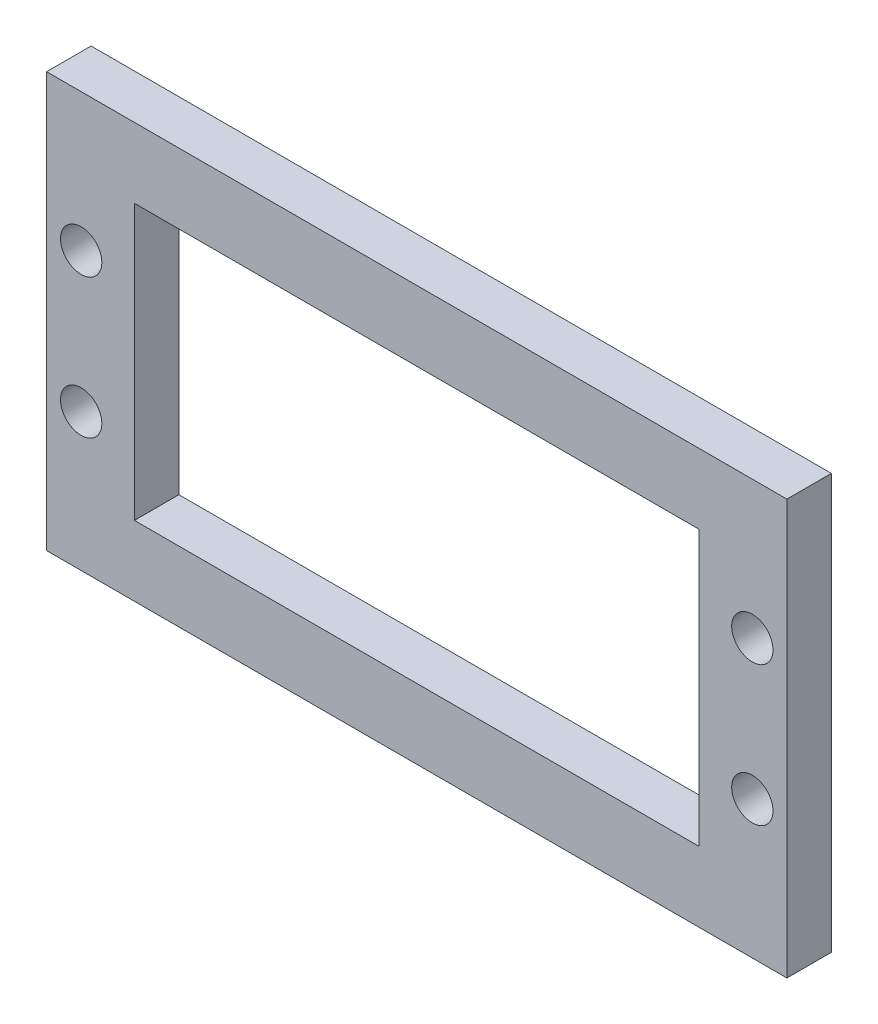
ISO-10303-21;
HEADER;
FILE_DESCRIPTION(('STEP AP214'),'2;1');
FILE_NAME('part.step','',(''),(''),'','','');
FILE_SCHEMA(('AUTOMOTIVE_DESIGN { 1 0 10303 214 1 1 1 1 }'));
ENDSEC;
DATA;
#1=APPLICATION_CONTEXT('core data for automotive mechanical design processes');
#2=APPLICATION_PROTOCOL_DEFINITION('international standard','automotive_design',2000,#1);
#3=PRODUCT_CONTEXT('',#1,'mechanical');
#4=PRODUCT('Part','Part','',(#3));
#5=PRODUCT_RELATED_PRODUCT_CATEGORY('part','',(#4));
#6=PRODUCT_DEFINITION_FORMATION('','',#4);
#7=PRODUCT_DEFINITION_CONTEXT('part definition',#1,'design');
#8=PRODUCT_DEFINITION('design','',#6,#7);
#9=PRODUCT_DEFINITION_SHAPE('','',#8);
#10=(LENGTH_UNIT() NAMED_UNIT(*) SI_UNIT(.MILLI.,.METRE.));
#11=(NAMED_UNIT(*) PLANE_ANGLE_UNIT() SI_UNIT($,.RADIAN.));
#12=(NAMED_UNIT(*) SI_UNIT($,.STERADIAN.) SOLID_ANGLE_UNIT());
#13=UNCERTAINTY_MEASURE_WITH_UNIT(LENGTH_MEASURE(1.E-05),#10,'distance_accuracy_value','');
#14=(GEOMETRIC_REPRESENTATION_CONTEXT(3) GLOBAL_UNCERTAINTY_ASSIGNED_CONTEXT((#13)) GLOBAL_UNIT_ASSIGNED_CONTEXT((#10,
#11,#12)) REPRESENTATION_CONTEXT('',''));
#15=CARTESIAN_POINT('',(0.,0.,0.));
#16=DIRECTION('',(0.,0.,1.));
#17=DIRECTION('',(1.,0.,0.));
#18=AXIS2_PLACEMENT_3D('',#15,#16,#17);
#19=CARTESIAN_POINT('',(-20.15,0.,3.175));
#20=DIRECTION('',(-1.,0.,0.));
#21=DIRECTION('',(0.,0.,1.));
#22=AXIS2_PLACEMENT_3D('',#19,#20,#21);
#23=PLANE('',#22);
#24=DIRECTION('',(0.,1.,0.));
#25=VECTOR('',#24,1.);
#26=CARTESIAN_POINT('',(-20.15,0.,0.));
#27=LINE('',#26,#25);
#28=CARTESIAN_POINT('',(-20.15,-9.8,0.));
#29=VERTEX_POINT('',#28);
#30=CARTESIAN_POINT('',(-20.15,9.8,0.));
#31=VERTEX_POINT('',#30);
#32=EDGE_CURVE('E176',#29,#31,#27,.T.);
#33=ORIENTED_EDGE('',*,*,#32,.T.);
#34=DIRECTION('',(0.,0.,-1.));
#35=VECTOR('',#34,1.);
#36=CARTESIAN_POINT('',(-20.15,9.8,3.175));
#37=LINE('',#36,#35);
#38=CARTESIAN_POINT('',(-20.15,9.8,3.175));
#39=VERTEX_POINT('',#38);
#40=EDGE_CURVE('E49',#39,#31,#37,.T.);
#41=ORIENTED_EDGE('',*,*,#40,.F.);
#42=DIRECTION('',(0.,1.,0.));
#43=VECTOR('',#42,1.);
#44=CARTESIAN_POINT('',(-20.15,0.,3.175));
#45=LINE('',#44,#43);
#46=CARTESIAN_POINT('',(-20.15,-9.8,3.175));
#47=VERTEX_POINT('',#46);
#48=EDGE_CURVE('E184',#47,#39,#45,.T.);
#49=ORIENTED_EDGE('',*,*,#48,.F.);
#50=DIRECTION('',(0.,0.,-1.));
#51=VECTOR('',#50,1.);
#52=CARTESIAN_POINT('',(-20.15,-9.8,3.175));
#53=LINE('',#52,#51);
#54=EDGE_CURVE('E11',#47,#29,#53,.T.);
#55=ORIENTED_EDGE('',*,*,#54,.T.);
#56=EDGE_LOOP('',(#33,#41,#49,#55));
#57=FACE_BOUND('',#56,.T.);
#58=ADVANCED_FACE('F39',(#57),#23,.F.);
#59=CARTESIAN_POINT('',(-26.416,0.,3.175));
#60=DIRECTION('',(-1.,0.,0.));
#61=DIRECTION('',(0.,0.,1.));
#62=AXIS2_PLACEMENT_3D('',#59,#60,#61);
#63=PLANE('',#62);
#64=DIRECTION('',(0.,1.,0.));
#65=VECTOR('',#64,1.);
#66=CARTESIAN_POINT('',(-26.416,0.,0.));
#67=LINE('',#66,#65);
#68=CARTESIAN_POINT('',(-26.416,-14.8,0.));
#69=VERTEX_POINT('',#68);
#70=CARTESIAN_POINT('',(-26.416,14.8,0.));
#71=VERTEX_POINT('',#70);
#72=EDGE_CURVE('E100',#69,#71,#67,.T.);
#73=ORIENTED_EDGE('',*,*,#72,.F.);
#74=DIRECTION('',(0.,0.,-1.));
#75=VECTOR('',#74,1.);
#76=CARTESIAN_POINT('',(-26.416,-14.8,3.175));
#77=LINE('',#76,#75);
#78=CARTESIAN_POINT('',(-26.416,-14.8,3.175));
#79=VERTEX_POINT('',#78);
#80=EDGE_CURVE('E43',#79,#69,#77,.T.);
#81=ORIENTED_EDGE('',*,*,#80,.F.);
#82=DIRECTION('',(0.,1.,0.));
#83=VECTOR('',#82,1.);
#84=CARTESIAN_POINT('',(-26.416,0.,3.175));
#85=LINE('',#84,#83);
#86=CARTESIAN_POINT('',(-26.416,14.8,3.175));
#87=VERTEX_POINT('',#86);
#88=EDGE_CURVE('E173',#79,#87,#85,.T.);
#89=ORIENTED_EDGE('',*,*,#88,.T.);
#90=DIRECTION('',(0.,0.,-1.));
#91=VECTOR('',#90,1.);
#92=CARTESIAN_POINT('',(-26.416,14.8,3.175));
#93=LINE('',#92,#91);
#94=EDGE_CURVE('E139',#87,#71,#93,.T.);
#95=ORIENTED_EDGE('',*,*,#94,.T.);
#96=EDGE_LOOP('',(#73,#81,#89,#95));
#97=FACE_BOUND('',#96,.T.);
#98=ADVANCED_FACE('F252',(#97),#63,.T.);
#99=CARTESIAN_POINT('',(-23.95,-4.974,3.175));
#100=DIRECTION('',(0.,0.,-1.));
#101=DIRECTION('',(-1.,0.,0.));
#102=AXIS2_PLACEMENT_3D('',#99,#100,#101);
#103=CYLINDRICAL_SURFACE('',#102,1.475);
#104=CARTESIAN_POINT('',(-23.95,-4.974,3.175));
#105=DIRECTION('',(0.,0.,1.));
#106=DIRECTION('',(1.,0.,0.));
#107=AXIS2_PLACEMENT_3D('',#104,#105,#106);
#108=CIRCLE('',#107,1.475);
#109=CARTESIAN_POINT('',(-22.475,-4.974,3.175));
#110=VERTEX_POINT('',#109);
#111=EDGE_CURVE('E187',#110,#110,#108,.T.);
#112=ORIENTED_EDGE('',*,*,#111,.T.);
#113=EDGE_LOOP('',(#112));
#114=FACE_BOUND('',#113,.T.);
#115=CARTESIAN_POINT('',(-23.95,-4.974,0.));
#116=DIRECTION('',(0.,0.,1.));
#117=DIRECTION('',(1.,0.,0.));
#118=AXIS2_PLACEMENT_3D('',#115,#116,#117);
#119=CIRCLE('',#118,1.475);
#120=CARTESIAN_POINT('',(-22.475,-4.974,0.));
#121=VERTEX_POINT('',#120);
#122=EDGE_CURVE('E178',#121,#121,#119,.T.);
#123=ORIENTED_EDGE('',*,*,#122,.F.);
#124=EDGE_LOOP('',(#123));
#125=FACE_BOUND('',#124,.T.);
#126=ADVANCED_FACE('F222',(#114,#125),#103,.F.);
#127=CARTESIAN_POINT('',(-23.95,4.974,3.175));
#128=DIRECTION('',(0.,0.,-1.));
#129=DIRECTION('',(-1.,0.,0.));
#130=AXIS2_PLACEMENT_3D('',#127,#128,#129);
#131=CYLINDRICAL_SURFACE('',#130,1.475);
#132=CARTESIAN_POINT('',(-23.95,4.974,3.175));
#133=DIRECTION('',(0.,0.,1.));
#134=DIRECTION('',(1.,0.,0.));
#135=AXIS2_PLACEMENT_3D('',#132,#133,#134);
#136=CIRCLE('',#135,1.475);
#137=CARTESIAN_POINT('',(-22.475,4.974,3.175));
#138=VERTEX_POINT('',#137);
#139=EDGE_CURVE('E175',#138,#138,#136,.T.);
#140=ORIENTED_EDGE('',*,*,#139,.T.);
#141=EDGE_LOOP('',(#140));
#142=FACE_BOUND('',#141,.T.);
#143=CARTESIAN_POINT('',(-23.95,4.974,0.));
#144=DIRECTION('',(0.,0.,1.));
#145=DIRECTION('',(1.,0.,0.));
#146=AXIS2_PLACEMENT_3D('',#143,#144,#145);
#147=CIRCLE('',#146,1.475);
#148=CARTESIAN_POINT('',(-22.475,4.974,0.));
#149=VERTEX_POINT('',#148);
#150=EDGE_CURVE('E152',#149,#149,#147,.T.);
#151=ORIENTED_EDGE('',*,*,#150,.F.);
#152=EDGE_LOOP('',(#151));
#153=FACE_BOUND('',#152,.T.);
#154=ADVANCED_FACE('F193',(#142,#153),#131,.F.);
#155=CARTESIAN_POINT('',(0.,0.,0.));
#156=DIRECTION('',(0.,0.,1.));
#157=DIRECTION('',(1.,0.,0.));
#158=AXIS2_PLACEMENT_3D('',#155,#156,#157);
#159=PLANE('',#158);
#160=DIRECTION('',(0.,1.,0.));
#161=VECTOR('',#160,1.);
#162=CARTESIAN_POINT('',(26.416,0.,0.));
#163=LINE('',#162,#161);
#164=CARTESIAN_POINT('',(26.416,-14.8,0.));
#165=VERTEX_POINT('',#164);
#166=CARTESIAN_POINT('',(26.416,14.8,0.));
#167=VERTEX_POINT('',#166);
#168=EDGE_CURVE('E106',#165,#167,#163,.T.);
#169=ORIENTED_EDGE('',*,*,#168,.F.);
#170=DIRECTION('',(-1.,0.,0.));
#171=VECTOR('',#170,1.);
#172=CARTESIAN_POINT('',(26.416,-14.8,0.));
#173=LINE('',#172,#171);
#174=EDGE_CURVE('E111',#165,#69,#173,.T.);
#175=ORIENTED_EDGE('',*,*,#174,.T.);
#176=ORIENTED_EDGE('',*,*,#72,.T.);
#177=DIRECTION('',(1.,0.,0.));
#178=VECTOR('',#177,1.);
#179=CARTESIAN_POINT('',(-26.416,14.8,0.));
#180=LINE('',#179,#178);
#181=EDGE_CURVE('E113',#71,#167,#180,.T.);
#182=ORIENTED_EDGE('',*,*,#181,.T.);
#183=EDGE_LOOP('',(#169,#175,#176,#182));
#184=FACE_BOUND('',#183,.T.);
#185=ORIENTED_EDGE('',*,*,#150,.T.);
#186=EDGE_LOOP('',(#185));
#187=FACE_BOUND('',#186,.T.);
#188=ORIENTED_EDGE('',*,*,#122,.T.);
#189=EDGE_LOOP('',(#188));
#190=FACE_BOUND('',#189,.T.);
#191=ORIENTED_EDGE('',*,*,#32,.F.);
#192=DIRECTION('',(-1.,0.,0.));
#193=VECTOR('',#192,1.);
#194=CARTESIAN_POINT('',(26.416,-9.8,0.));
#195=LINE('',#194,#193);
#196=CARTESIAN_POINT('',(20.15,-9.8,0.));
#197=VERTEX_POINT('',#196);
#198=EDGE_CURVE('E127',#197,#29,#195,.T.);
#199=ORIENTED_EDGE('',*,*,#198,.F.);
#200=DIRECTION('',(0.,1.,0.));
#201=VECTOR('',#200,1.);
#202=CARTESIAN_POINT('',(20.15,0.,0.));
#203=LINE('',#202,#201);
#204=CARTESIAN_POINT('',(20.15,9.8,0.));
#205=VERTEX_POINT('',#204);
#206=EDGE_CURVE('E118',#197,#205,#203,.T.);
#207=ORIENTED_EDGE('',*,*,#206,.T.);
#208=DIRECTION('',(1.,0.,0.));
#209=VECTOR('',#208,1.);
#210=CARTESIAN_POINT('',(-26.416,9.8,0.));
#211=LINE('',#210,#209);
#212=EDGE_CURVE('E143',#31,#205,#211,.T.);
#213=ORIENTED_EDGE('',*,*,#212,.F.);
#214=EDGE_LOOP('',(#191,#199,#207,#213));
#215=FACE_BOUND('',#214,.T.);
#216=CARTESIAN_POINT('',(23.95,-4.974,0.));
#217=DIRECTION('',(0.,0.,1.));
#218=DIRECTION('',(1.,0.,0.));
#219=AXIS2_PLACEMENT_3D('',#216,#217,#218);
#220=CIRCLE('',#219,1.475);
#221=CARTESIAN_POINT('',(25.425,-4.974,0.));
#222=VERTEX_POINT('',#221);
#223=EDGE_CURVE('E142',#222,#222,#220,.T.);
#224=ORIENTED_EDGE('',*,*,#223,.T.);
#225=EDGE_LOOP('',(#224));
#226=FACE_BOUND('',#225,.T.);
#227=CARTESIAN_POINT('',(23.95,4.974,0.));
#228=DIRECTION('',(0.,0.,1.));
#229=DIRECTION('',(1.,0.,0.));
#230=AXIS2_PLACEMENT_3D('',#227,#228,#229);
#231=CIRCLE('',#230,1.475);
#232=CARTESIAN_POINT('',(25.425,4.974,0.));
#233=VERTEX_POINT('',#232);
#234=EDGE_CURVE('E158',#233,#233,#231,.T.);
#235=ORIENTED_EDGE('',*,*,#234,.T.);
#236=EDGE_LOOP('',(#235));
#237=FACE_BOUND('',#236,.T.);
#238=ADVANCED_FACE('F108',(#184,#187,#190,#215,#226,#237),#159,.F.);
#239=CARTESIAN_POINT('',(0.,0.,3.175));
#240=DIRECTION('',(0.,0.,1.));
#241=DIRECTION('',(1.,0.,0.));
#242=AXIS2_PLACEMENT_3D('',#239,#240,#241);
#243=PLANE('',#242);
#244=DIRECTION('',(-1.,0.,0.));
#245=VECTOR('',#244,1.);
#246=CARTESIAN_POINT('',(26.416,-14.8,3.175));
#247=LINE('',#246,#245);
#248=CARTESIAN_POINT('',(26.416,-14.8,3.175));
#249=VERTEX_POINT('',#248);
#250=EDGE_CURVE('E130',#249,#79,#247,.T.);
#251=ORIENTED_EDGE('',*,*,#250,.F.);
#252=DIRECTION('',(0.,1.,0.));
#253=VECTOR('',#252,1.);
#254=CARTESIAN_POINT('',(26.416,0.,3.175));
#255=LINE('',#254,#253);
#256=CARTESIAN_POINT('',(26.416,14.8,3.175));
#257=VERTEX_POINT('',#256);
#258=EDGE_CURVE('E123',#249,#257,#255,.T.);
#259=ORIENTED_EDGE('',*,*,#258,.T.);
#260=DIRECTION('',(1.,0.,0.));
#261=VECTOR('',#260,1.);
#262=CARTESIAN_POINT('',(-26.416,14.8,3.175));
#263=LINE('',#262,#261);
#264=EDGE_CURVE('E145',#87,#257,#263,.T.);
#265=ORIENTED_EDGE('',*,*,#264,.F.);
#266=ORIENTED_EDGE('',*,*,#88,.F.);
#267=EDGE_LOOP('',(#251,#259,#265,#266));
#268=FACE_BOUND('',#267,.T.);
#269=ORIENTED_EDGE('',*,*,#139,.F.);
#270=EDGE_LOOP('',(#269));
#271=FACE_BOUND('',#270,.T.);
#272=ORIENTED_EDGE('',*,*,#111,.F.);
#273=EDGE_LOOP('',(#272));
#274=FACE_BOUND('',#273,.T.);
#275=DIRECTION('',(0.,1.,0.));
#276=VECTOR('',#275,1.);
#277=CARTESIAN_POINT('',(20.15,0.,3.175));
#278=LINE('',#277,#276);
#279=CARTESIAN_POINT('',(20.15,-9.8,3.175));
#280=VERTEX_POINT('',#279);
#281=CARTESIAN_POINT('',(20.15,9.8,3.175));
#282=VERTEX_POINT('',#281);
#283=EDGE_CURVE('E164',#280,#282,#278,.T.);
#284=ORIENTED_EDGE('',*,*,#283,.F.);
#285=DIRECTION('',(-1.,0.,0.));
#286=VECTOR('',#285,1.);
#287=CARTESIAN_POINT('',(26.416,-9.8,3.175));
#288=LINE('',#287,#286);
#289=EDGE_CURVE('E133',#280,#47,#288,.T.);
#290=ORIENTED_EDGE('',*,*,#289,.T.);
#291=ORIENTED_EDGE('',*,*,#48,.T.);
#292=DIRECTION('',(1.,0.,0.));
#293=VECTOR('',#292,1.);
#294=CARTESIAN_POINT('',(-26.416,9.8,3.175));
#295=LINE('',#294,#293);
#296=EDGE_CURVE('E140',#39,#282,#295,.T.);
#297=ORIENTED_EDGE('',*,*,#296,.T.);
#298=EDGE_LOOP('',(#284,#290,#291,#297));
#299=FACE_BOUND('',#298,.T.);
#300=CARTESIAN_POINT('',(23.95,-4.974,3.175));
#301=DIRECTION('',(0.,0.,1.));
#302=DIRECTION('',(1.,0.,0.));
#303=AXIS2_PLACEMENT_3D('',#300,#301,#302);
#304=CIRCLE('',#303,1.475);
#305=CARTESIAN_POINT('',(25.425,-4.974,3.175));
#306=VERTEX_POINT('',#305);
#307=EDGE_CURVE('E117',#306,#306,#304,.T.);
#308=ORIENTED_EDGE('',*,*,#307,.F.);
#309=EDGE_LOOP('',(#308));
#310=FACE_BOUND('',#309,.T.);
#311=CARTESIAN_POINT('',(23.95,4.974,3.175));
#312=DIRECTION('',(0.,0.,1.));
#313=DIRECTION('',(1.,0.,0.));
#314=AXIS2_PLACEMENT_3D('',#311,#312,#313);
#315=CIRCLE('',#314,1.475);
#316=CARTESIAN_POINT('',(25.425,4.974,3.175));
#317=VERTEX_POINT('',#316);
#318=EDGE_CURVE('E167',#317,#317,#315,.T.);
#319=ORIENTED_EDGE('',*,*,#318,.F.);
#320=EDGE_LOOP('',(#319));
#321=FACE_BOUND('',#320,.T.);
#322=ADVANCED_FACE('F196',(#268,#271,#274,#299,#310,#321),#243,.T.);
#323=CARTESIAN_POINT('',(26.416,0.,3.175));
#324=DIRECTION('',(-1.,0.,0.));
#325=DIRECTION('',(0.,0.,1.));
#326=AXIS2_PLACEMENT_3D('',#323,#324,#325);
#327=PLANE('',#326);
#328=ORIENTED_EDGE('',*,*,#168,.T.);
#329=DIRECTION('',(0.,0.,-1.));
#330=VECTOR('',#329,1.);
#331=CARTESIAN_POINT('',(26.416,14.8,3.175));
#332=LINE('',#331,#330);
#333=EDGE_CURVE('E137',#257,#167,#332,.T.);
#334=ORIENTED_EDGE('',*,*,#333,.F.);
#335=ORIENTED_EDGE('',*,*,#258,.F.);
#336=DIRECTION('',(0.,0.,-1.));
#337=VECTOR('',#336,1.);
#338=CARTESIAN_POINT('',(26.416,-14.8,3.175));
#339=LINE('',#338,#337);
#340=EDGE_CURVE('E121',#249,#165,#339,.T.);
#341=ORIENTED_EDGE('',*,*,#340,.T.);
#342=EDGE_LOOP('',(#328,#334,#335,#341));
#343=FACE_BOUND('',#342,.T.);
#344=ADVANCED_FACE('F122',(#343),#327,.F.);
#345=CARTESIAN_POINT('',(23.95,4.974,3.175));
#346=DIRECTION('',(0.,0.,-1.));
#347=DIRECTION('',(-1.,0.,0.));
#348=AXIS2_PLACEMENT_3D('',#345,#346,#347);
#349=CYLINDRICAL_SURFACE('',#348,1.475);
#350=ORIENTED_EDGE('',*,*,#318,.T.);
#351=EDGE_LOOP('',(#350));
#352=FACE_BOUND('',#351,.T.);
#353=ORIENTED_EDGE('',*,*,#234,.F.);
#354=EDGE_LOOP('',(#353));
#355=FACE_BOUND('',#354,.T.);
#356=ADVANCED_FACE('F209',(#352,#355),#349,.F.);
#357=CARTESIAN_POINT('',(23.95,-4.974,3.175));
#358=DIRECTION('',(0.,0.,-1.));
#359=DIRECTION('',(-1.,0.,0.));
#360=AXIS2_PLACEMENT_3D('',#357,#358,#359);
#361=CYLINDRICAL_SURFACE('',#360,1.475);
#362=ORIENTED_EDGE('',*,*,#307,.T.);
#363=EDGE_LOOP('',(#362));
#364=FACE_BOUND('',#363,.T.);
#365=ORIENTED_EDGE('',*,*,#223,.F.);
#366=EDGE_LOOP('',(#365));
#367=FACE_BOUND('',#366,.T.);
#368=ADVANCED_FACE('F212',(#364,#367),#361,.F.);
#369=CARTESIAN_POINT('',(20.15,0.,3.175));
#370=DIRECTION('',(-1.,0.,0.));
#371=DIRECTION('',(0.,0.,1.));
#372=AXIS2_PLACEMENT_3D('',#369,#370,#371);
#373=PLANE('',#372);
#374=ORIENTED_EDGE('',*,*,#206,.F.);
#375=DIRECTION('',(0.,0.,-1.));
#376=VECTOR('',#375,1.);
#377=CARTESIAN_POINT('',(20.15,-9.8,3.175));
#378=LINE('',#377,#376);
#379=EDGE_CURVE('E150',#280,#197,#378,.T.);
#380=ORIENTED_EDGE('',*,*,#379,.F.);
#381=ORIENTED_EDGE('',*,*,#283,.T.);
#382=DIRECTION('',(0.,0.,-1.));
#383=VECTOR('',#382,1.);
#384=CARTESIAN_POINT('',(20.15,9.8,3.175));
#385=LINE('',#384,#383);
#386=EDGE_CURVE('E153',#282,#205,#385,.T.);
#387=ORIENTED_EDGE('',*,*,#386,.T.);
#388=EDGE_LOOP('',(#374,#380,#381,#387));
#389=FACE_BOUND('',#388,.T.);
#390=ADVANCED_FACE('F227',(#389),#373,.T.);
#391=CARTESIAN_POINT('',(-26.416,9.8,3.175));
#392=DIRECTION('',(0.,1.,0.));
#393=DIRECTION('',(0.,0.,1.));
#394=AXIS2_PLACEMENT_3D('',#391,#392,#393);
#395=PLANE('',#394);
#396=ORIENTED_EDGE('',*,*,#296,.F.);
#397=ORIENTED_EDGE('',*,*,#40,.T.);
#398=ORIENTED_EDGE('',*,*,#212,.T.);
#399=ORIENTED_EDGE('',*,*,#386,.F.);
#400=EDGE_LOOP('',(#396,#397,#398,#399));
#401=FACE_BOUND('',#400,.T.);
#402=ADVANCED_FACE('F225',(#401),#395,.F.);
#403=CARTESIAN_POINT('',(26.416,-9.8,3.175));
#404=DIRECTION('',(0.,-1.,0.));
#405=DIRECTION('',(0.,0.,-1.));
#406=AXIS2_PLACEMENT_3D('',#403,#404,#405);
#407=PLANE('',#406);
#408=ORIENTED_EDGE('',*,*,#198,.T.);
#409=ORIENTED_EDGE('',*,*,#54,.F.);
#410=ORIENTED_EDGE('',*,*,#289,.F.);
#411=ORIENTED_EDGE('',*,*,#379,.T.);
#412=EDGE_LOOP('',(#408,#409,#410,#411));
#413=FACE_BOUND('',#412,.T.);
#414=ADVANCED_FACE('F214',(#413),#407,.F.);
#415=CARTESIAN_POINT('',(26.416,-14.8,3.175));
#416=DIRECTION('',(0.,-1.,0.));
#417=DIRECTION('',(1.,0.,0.));
#418=AXIS2_PLACEMENT_3D('',#415,#416,#417);
#419=PLANE('',#418);
#420=ORIENTED_EDGE('',*,*,#174,.F.);
#421=ORIENTED_EDGE('',*,*,#340,.F.);
#422=ORIENTED_EDGE('',*,*,#250,.T.);
#423=ORIENTED_EDGE('',*,*,#80,.T.);
#424=EDGE_LOOP('',(#420,#421,#422,#423));
#425=FACE_BOUND('',#424,.T.);
#426=ADVANCED_FACE('F41',(#425),#419,.T.);
#427=CARTESIAN_POINT('',(-26.416,14.8,3.175));
#428=DIRECTION('',(0.,1.,0.));
#429=DIRECTION('',(0.,0.,1.));
#430=AXIS2_PLACEMENT_3D('',#427,#428,#429);
#431=PLANE('',#430);
#432=ORIENTED_EDGE('',*,*,#181,.F.);
#433=ORIENTED_EDGE('',*,*,#94,.F.);
#434=ORIENTED_EDGE('',*,*,#264,.T.);
#435=ORIENTED_EDGE('',*,*,#333,.T.);
#436=EDGE_LOOP('',(#432,#433,#434,#435));
#437=FACE_BOUND('',#436,.T.);
#438=ADVANCED_FACE('F239',(#437),#431,.T.);
#439=CLOSED_SHELL('',(#58,#98,#126,#154,#238,#322,#344,#356,#368,#390,#402,#414,#426,#438));
#440=MANIFOLD_SOLID_BREP('B2',#439);
#441=ADVANCED_BREP_SHAPE_REPRESENTATION('',(#18,#440),#14);
#442=SHAPE_DEFINITION_REPRESENTATION(#9,#441);
ENDSEC;
END-ISO-10303-21;
